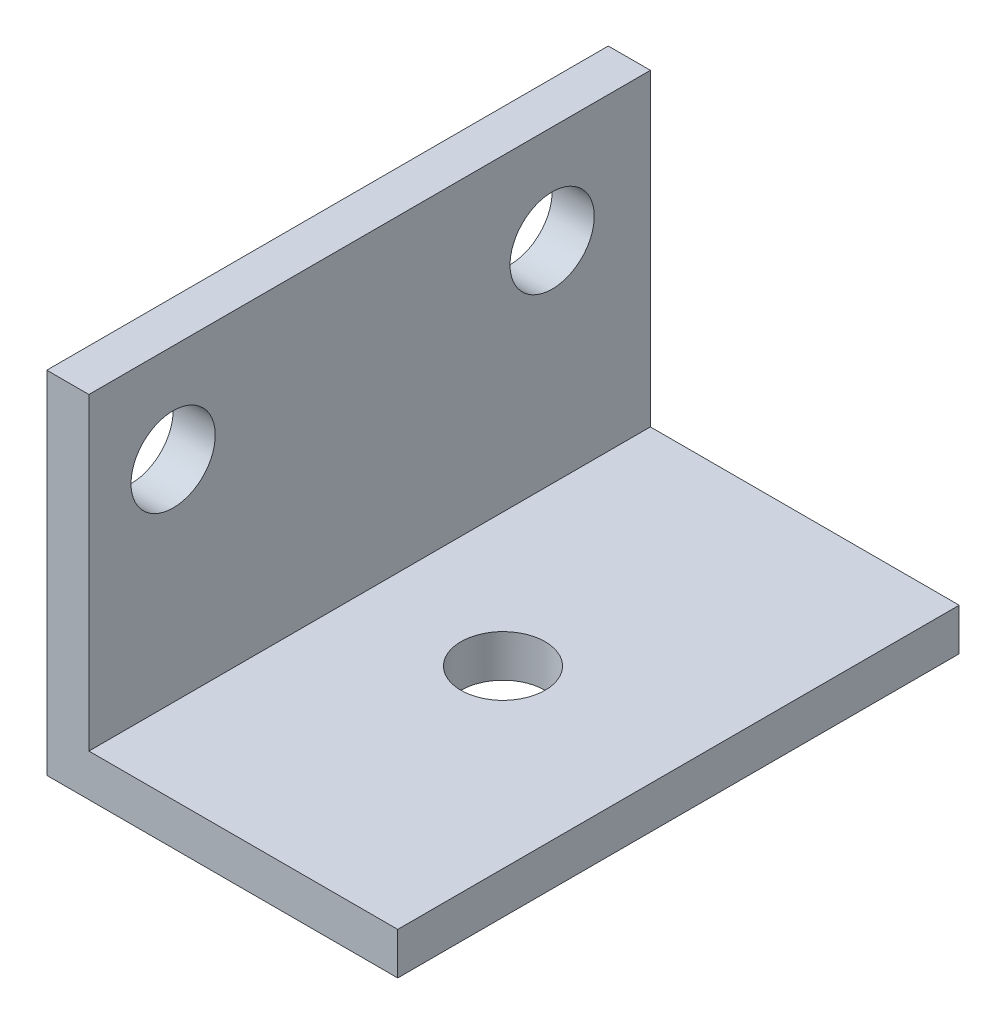
ISO-10303-21;
HEADER;
FILE_DESCRIPTION(('STEP AP214'),'2;1');
FILE_NAME('part.step','',(''),(''),'','','');
FILE_SCHEMA(('AUTOMOTIVE_DESIGN { 1 0 10303 214 1 1 1 1 }'));
ENDSEC;
DATA;
#1=APPLICATION_CONTEXT('core data for automotive mechanical design processes');
#2=APPLICATION_PROTOCOL_DEFINITION('international standard','automotive_design',2000,#1);
#3=PRODUCT_CONTEXT('',#1,'mechanical');
#4=PRODUCT('Part','Part','',(#3));
#5=PRODUCT_RELATED_PRODUCT_CATEGORY('part','',(#4));
#6=PRODUCT_DEFINITION_FORMATION('','',#4);
#7=PRODUCT_DEFINITION_CONTEXT('part definition',#1,'design');
#8=PRODUCT_DEFINITION('design','',#6,#7);
#9=PRODUCT_DEFINITION_SHAPE('','',#8);
#10=(LENGTH_UNIT() NAMED_UNIT(*) SI_UNIT(.MILLI.,.METRE.));
#11=(NAMED_UNIT(*) PLANE_ANGLE_UNIT() SI_UNIT($,.RADIAN.));
#12=(NAMED_UNIT(*) SI_UNIT($,.STERADIAN.) SOLID_ANGLE_UNIT());
#13=UNCERTAINTY_MEASURE_WITH_UNIT(LENGTH_MEASURE(1.E-05),#10,'distance_accuracy_value','');
#14=(GEOMETRIC_REPRESENTATION_CONTEXT(3) GLOBAL_UNCERTAINTY_ASSIGNED_CONTEXT((#13)) GLOBAL_UNIT_ASSIGNED_CONTEXT((#10,
#11,#12)) REPRESENTATION_CONTEXT('',''));
#15=CARTESIAN_POINT('',(0.,0.,0.));
#16=DIRECTION('',(0.,0.,1.));
#17=DIRECTION('',(1.,0.,0.));
#18=AXIS2_PLACEMENT_3D('',#15,#16,#17);
#19=CARTESIAN_POINT('',(0.,12.5,20.));
#20=DIRECTION('',(1.,0.,0.));
#21=DIRECTION('',(0.,1.,0.));
#22=AXIS2_PLACEMENT_3D('',#19,#20,#21);
#23=PLANE('',#22);
#24=CARTESIAN_POINT('',(0.,9.,17.));
#25=DIRECTION('',(-1.,0.,0.));
#26=DIRECTION('',(0.,-1.,0.));
#27=AXIS2_PLACEMENT_3D('',#24,#25,#26);
#28=CIRCLE('',#27,1.5);
#29=CARTESIAN_POINT('',(0.,7.5,17.));
#30=VERTEX_POINT('',#29);
#31=EDGE_CURVE('E183',#30,#30,#28,.T.);
#32=ORIENTED_EDGE('',*,*,#31,.F.);
#33=EDGE_LOOP('',(#32));
#34=FACE_BOUND('',#33,.T.);
#35=CARTESIAN_POINT('',(0.,9.,3.5));
#36=DIRECTION('',(-1.,0.,0.));
#37=DIRECTION('',(0.,-1.,0.));
#38=AXIS2_PLACEMENT_3D('',#35,#36,#37);
#39=CIRCLE('',#38,1.5);
#40=CARTESIAN_POINT('',(0.,7.5,3.5));
#41=VERTEX_POINT('',#40);
#42=EDGE_CURVE('E186',#41,#41,#39,.T.);
#43=ORIENTED_EDGE('',*,*,#42,.F.);
#44=EDGE_LOOP('',(#43));
#45=FACE_BOUND('',#44,.T.);
#46=DIRECTION('',(0.,-1.,0.));
#47=VECTOR('',#46,1.);
#48=CARTESIAN_POINT('',(0.,12.5,0.));
#49=LINE('',#48,#47);
#50=CARTESIAN_POINT('',(0.,12.5,0.));
#51=VERTEX_POINT('',#50);
#52=CARTESIAN_POINT('',(0.,0.,0.));
#53=VERTEX_POINT('',#52);
#54=EDGE_CURVE('E128',#51,#53,#49,.T.);
#55=ORIENTED_EDGE('',*,*,#54,.T.);
#56=DIRECTION('',(0.,0.,-1.));
#57=VECTOR('',#56,1.);
#58=CARTESIAN_POINT('',(0.,0.,20.));
#59=LINE('',#58,#57);
#60=CARTESIAN_POINT('',(0.,0.,20.));
#61=VERTEX_POINT('',#60);
#62=EDGE_CURVE('E11',#61,#53,#59,.T.);
#63=ORIENTED_EDGE('',*,*,#62,.F.);
#64=DIRECTION('',(0.,-1.,0.));
#65=VECTOR('',#64,1.);
#66=CARTESIAN_POINT('',(0.,12.5,20.));
#67=LINE('',#66,#65);
#68=CARTESIAN_POINT('',(0.,12.5,20.));
#69=VERTEX_POINT('',#68);
#70=EDGE_CURVE('E145',#69,#61,#67,.T.);
#71=ORIENTED_EDGE('',*,*,#70,.F.);
#72=DIRECTION('',(0.,0.,-1.));
#73=VECTOR('',#72,1.);
#74=CARTESIAN_POINT('',(0.,12.5,20.));
#75=LINE('',#74,#73);
#76=EDGE_CURVE('E124',#69,#51,#75,.T.);
#77=ORIENTED_EDGE('',*,*,#76,.T.);
#78=EDGE_LOOP('',(#55,#63,#71,#77));
#79=FACE_BOUND('',#78,.T.);
#80=ADVANCED_FACE('F39',(#34,#45,#79),#23,.F.);
#81=CARTESIAN_POINT('',(0.,0.,20.));
#82=DIRECTION('',(0.,1.,0.));
#83=DIRECTION('',(0.,0.,1.));
#84=AXIS2_PLACEMENT_3D('',#81,#82,#83);
#85=PLANE('',#84);
#86=CARTESIAN_POINT('',(6.25,0.,10.));
#87=DIRECTION('',(0.,-1.,0.));
#88=DIRECTION('',(0.,0.,-1.));
#89=AXIS2_PLACEMENT_3D('',#86,#87,#88);
#90=CIRCLE('',#89,1.5);
#91=CARTESIAN_POINT('',(6.25,0.,8.5));
#92=VERTEX_POINT('',#91);
#93=EDGE_CURVE('E197',#92,#92,#90,.T.);
#94=ORIENTED_EDGE('',*,*,#93,.F.);
#95=EDGE_LOOP('',(#94));
#96=FACE_BOUND('',#95,.T.);
#97=DIRECTION('',(1.,0.,0.));
#98=VECTOR('',#97,1.);
#99=CARTESIAN_POINT('',(0.,0.,0.));
#100=LINE('',#99,#98);
#101=CARTESIAN_POINT('',(12.5,0.,0.));
#102=VERTEX_POINT('',#101);
#103=EDGE_CURVE('E132',#53,#102,#100,.T.);
#104=ORIENTED_EDGE('',*,*,#103,.T.);
#105=DIRECTION('',(0.,0.,-1.));
#106=VECTOR('',#105,1.);
#107=CARTESIAN_POINT('',(12.5,0.,20.));
#108=LINE('',#107,#106);
#109=CARTESIAN_POINT('',(12.5,0.,20.));
#110=VERTEX_POINT('',#109);
#111=EDGE_CURVE('E48',#110,#102,#108,.T.);
#112=ORIENTED_EDGE('',*,*,#111,.F.);
#113=DIRECTION('',(1.,0.,0.));
#114=VECTOR('',#113,1.);
#115=CARTESIAN_POINT('',(0.,0.,20.));
#116=LINE('',#115,#114);
#117=EDGE_CURVE('E93',#61,#110,#116,.T.);
#118=ORIENTED_EDGE('',*,*,#117,.F.);
#119=ORIENTED_EDGE('',*,*,#62,.T.);
#120=EDGE_LOOP('',(#104,#112,#118,#119));
#121=FACE_BOUND('',#120,.T.);
#122=ADVANCED_FACE('F174',(#96,#121),#85,.F.);
#123=CARTESIAN_POINT('',(12.5,0.,20.));
#124=DIRECTION('',(-1.,0.,0.));
#125=DIRECTION('',(0.,0.,1.));
#126=AXIS2_PLACEMENT_3D('',#123,#124,#125);
#127=PLANE('',#126);
#128=DIRECTION('',(0.,1.,0.));
#129=VECTOR('',#128,1.);
#130=CARTESIAN_POINT('',(12.5,0.,0.));
#131=LINE('',#130,#129);
#132=CARTESIAN_POINT('',(12.5,1.5,0.));
#133=VERTEX_POINT('',#132);
#134=EDGE_CURVE('E136',#102,#133,#131,.T.);
#135=ORIENTED_EDGE('',*,*,#134,.T.);
#136=DIRECTION('',(0.,0.,-1.));
#137=VECTOR('',#136,1.);
#138=CARTESIAN_POINT('',(12.5,1.5,20.));
#139=LINE('',#138,#137);
#140=CARTESIAN_POINT('',(12.5,1.5,20.));
#141=VERTEX_POINT('',#140);
#142=EDGE_CURVE('E117',#141,#133,#139,.T.);
#143=ORIENTED_EDGE('',*,*,#142,.F.);
#144=DIRECTION('',(0.,1.,0.));
#145=VECTOR('',#144,1.);
#146=CARTESIAN_POINT('',(12.5,0.,20.));
#147=LINE('',#146,#145);
#148=EDGE_CURVE('E106',#110,#141,#147,.T.);
#149=ORIENTED_EDGE('',*,*,#148,.F.);
#150=ORIENTED_EDGE('',*,*,#111,.T.);
#151=EDGE_LOOP('',(#135,#143,#149,#150));
#152=FACE_BOUND('',#151,.T.);
#153=ADVANCED_FACE('F155',(#152),#127,.F.);
#154=CARTESIAN_POINT('',(12.5,1.5,20.));
#155=DIRECTION('',(0.,-1.,0.));
#156=DIRECTION('',(1.,0.,0.));
#157=AXIS2_PLACEMENT_3D('',#154,#155,#156);
#158=PLANE('',#157);
#159=CARTESIAN_POINT('',(6.25,1.5,10.));
#160=DIRECTION('',(0.,-1.,0.));
#161=DIRECTION('',(1.,0.,0.));
#162=AXIS2_PLACEMENT_3D('',#159,#160,#161);
#163=CIRCLE('',#162,1.5);
#164=CARTESIAN_POINT('',(7.75,1.5,10.));
#165=VERTEX_POINT('',#164);
#166=EDGE_CURVE('E190',#165,#165,#163,.F.);
#167=ORIENTED_EDGE('',*,*,#166,.F.);
#168=EDGE_LOOP('',(#167));
#169=FACE_BOUND('',#168,.T.);
#170=DIRECTION('',(-1.,0.,0.));
#171=VECTOR('',#170,1.);
#172=CARTESIAN_POINT('',(12.5,1.5,0.));
#173=LINE('',#172,#171);
#174=CARTESIAN_POINT('',(1.5,1.5,0.));
#175=VERTEX_POINT('',#174);
#176=EDGE_CURVE('E115',#133,#175,#173,.T.);
#177=ORIENTED_EDGE('',*,*,#176,.T.);
#178=DIRECTION('',(0.,0.,-1.));
#179=VECTOR('',#178,1.);
#180=CARTESIAN_POINT('',(1.5,1.5,20.));
#181=LINE('',#180,#179);
#182=CARTESIAN_POINT('',(1.5,1.5,20.));
#183=VERTEX_POINT('',#182);
#184=EDGE_CURVE('E112',#183,#175,#181,.T.);
#185=ORIENTED_EDGE('',*,*,#184,.F.);
#186=DIRECTION('',(-1.,0.,0.));
#187=VECTOR('',#186,1.);
#188=CARTESIAN_POINT('',(12.5,1.5,20.));
#189=LINE('',#188,#187);
#190=EDGE_CURVE('E100',#141,#183,#189,.T.);
#191=ORIENTED_EDGE('',*,*,#190,.F.);
#192=ORIENTED_EDGE('',*,*,#142,.T.);
#193=EDGE_LOOP('',(#177,#185,#191,#192));
#194=FACE_BOUND('',#193,.T.);
#195=ADVANCED_FACE('F113',(#169,#194),#158,.F.);
#196=CARTESIAN_POINT('',(1.5,1.5,20.));
#197=DIRECTION('',(-1.,0.,0.));
#198=DIRECTION('',(0.,-1.,0.));
#199=AXIS2_PLACEMENT_3D('',#196,#197,#198);
#200=PLANE('',#199);
#201=CARTESIAN_POINT('',(1.5,9.,17.));
#202=DIRECTION('',(-1.,0.,0.));
#203=DIRECTION('',(0.,-1.,0.));
#204=AXIS2_PLACEMENT_3D('',#201,#202,#203);
#205=CIRCLE('',#204,1.5);
#206=CARTESIAN_POINT('',(1.5,7.5,17.));
#207=VERTEX_POINT('',#206);
#208=EDGE_CURVE('E133',#207,#207,#205,.F.);
#209=ORIENTED_EDGE('',*,*,#208,.F.);
#210=EDGE_LOOP('',(#209));
#211=FACE_BOUND('',#210,.T.);
#212=CARTESIAN_POINT('',(1.5,9.,3.5));
#213=DIRECTION('',(-1.,0.,0.));
#214=DIRECTION('',(0.,-1.,0.));
#215=AXIS2_PLACEMENT_3D('',#212,#213,#214);
#216=CIRCLE('',#215,1.5);
#217=CARTESIAN_POINT('',(1.5,7.5,3.5));
#218=VERTEX_POINT('',#217);
#219=EDGE_CURVE('E189',#218,#218,#216,.F.);
#220=ORIENTED_EDGE('',*,*,#219,.F.);
#221=EDGE_LOOP('',(#220));
#222=FACE_BOUND('',#221,.T.);
#223=DIRECTION('',(0.,1.,0.));
#224=VECTOR('',#223,1.);
#225=CARTESIAN_POINT('',(1.5,1.5,0.));
#226=LINE('',#225,#224);
#227=CARTESIAN_POINT('',(1.5,12.5,0.));
#228=VERTEX_POINT('',#227);
#229=EDGE_CURVE('E79',#175,#228,#226,.T.);
#230=ORIENTED_EDGE('',*,*,#229,.T.);
#231=DIRECTION('',(0.,0.,-1.));
#232=VECTOR('',#231,1.);
#233=CARTESIAN_POINT('',(1.5,12.5,20.));
#234=LINE('',#233,#232);
#235=CARTESIAN_POINT('',(1.5,12.5,20.));
#236=VERTEX_POINT('',#235);
#237=EDGE_CURVE('E118',#236,#228,#234,.T.);
#238=ORIENTED_EDGE('',*,*,#237,.F.);
#239=DIRECTION('',(0.,1.,0.));
#240=VECTOR('',#239,1.);
#241=CARTESIAN_POINT('',(1.5,1.5,20.));
#242=LINE('',#241,#240);
#243=EDGE_CURVE('E104',#183,#236,#242,.T.);
#244=ORIENTED_EDGE('',*,*,#243,.F.);
#245=ORIENTED_EDGE('',*,*,#184,.T.);
#246=EDGE_LOOP('',(#230,#238,#244,#245));
#247=FACE_BOUND('',#246,.T.);
#248=ADVANCED_FACE('F120',(#211,#222,#247),#200,.F.);
#249=CARTESIAN_POINT('',(1.5,12.5,20.));
#250=DIRECTION('',(0.,-1.,0.));
#251=DIRECTION('',(0.,0.,-1.));
#252=AXIS2_PLACEMENT_3D('',#249,#250,#251);
#253=PLANE('',#252);
#254=DIRECTION('',(-1.,0.,0.));
#255=VECTOR('',#254,1.);
#256=CARTESIAN_POINT('',(1.5,12.5,0.));
#257=LINE('',#256,#255);
#258=EDGE_CURVE('E85',#228,#51,#257,.T.);
#259=ORIENTED_EDGE('',*,*,#258,.T.);
#260=ORIENTED_EDGE('',*,*,#76,.F.);
#261=DIRECTION('',(-1.,0.,0.));
#262=VECTOR('',#261,1.);
#263=CARTESIAN_POINT('',(1.5,12.5,20.));
#264=LINE('',#263,#262);
#265=EDGE_CURVE('E56',#236,#69,#264,.T.);
#266=ORIENTED_EDGE('',*,*,#265,.F.);
#267=ORIENTED_EDGE('',*,*,#237,.T.);
#268=EDGE_LOOP('',(#259,#260,#266,#267));
#269=FACE_BOUND('',#268,.T.);
#270=ADVANCED_FACE('F162',(#269),#253,.F.);
#271=CARTESIAN_POINT('',(0.,0.,20.));
#272=DIRECTION('',(0.,0.,1.));
#273=DIRECTION('',(1.,0.,0.));
#274=AXIS2_PLACEMENT_3D('',#271,#272,#273);
#275=PLANE('',#274);
#276=ORIENTED_EDGE('',*,*,#70,.T.);
#277=ORIENTED_EDGE('',*,*,#117,.T.);
#278=ORIENTED_EDGE('',*,*,#148,.T.);
#279=ORIENTED_EDGE('',*,*,#190,.T.);
#280=ORIENTED_EDGE('',*,*,#243,.T.);
#281=ORIENTED_EDGE('',*,*,#265,.T.);
#282=EDGE_LOOP('',(#276,#277,#278,#279,#280,#281));
#283=FACE_BOUND('',#282,.T.);
#284=ADVANCED_FACE('F102',(#283),#275,.T.);
#285=CARTESIAN_POINT('',(0.,0.,0.));
#286=DIRECTION('',(0.,0.,1.));
#287=DIRECTION('',(1.,0.,0.));
#288=AXIS2_PLACEMENT_3D('',#285,#286,#287);
#289=PLANE('',#288);
#290=ORIENTED_EDGE('',*,*,#54,.F.);
#291=ORIENTED_EDGE('',*,*,#258,.F.);
#292=ORIENTED_EDGE('',*,*,#229,.F.);
#293=ORIENTED_EDGE('',*,*,#176,.F.);
#294=ORIENTED_EDGE('',*,*,#134,.F.);
#295=ORIENTED_EDGE('',*,*,#103,.F.);
#296=EDGE_LOOP('',(#290,#291,#292,#293,#294,#295));
#297=FACE_BOUND('',#296,.T.);
#298=ADVANCED_FACE('F158',(#297),#289,.F.);
#299=CARTESIAN_POINT('',(5.74264068711929,9.,3.5));
#300=DIRECTION('',(-1.,0.,0.));
#301=DIRECTION('',(0.,-1.,0.));
#302=AXIS2_PLACEMENT_3D('',#299,#300,#301);
#303=CYLINDRICAL_SURFACE('',#302,1.5);
#304=ORIENTED_EDGE('',*,*,#219,.T.);
#305=EDGE_LOOP('',(#304));
#306=FACE_BOUND('',#305,.T.);
#307=ORIENTED_EDGE('',*,*,#42,.T.);
#308=EDGE_LOOP('',(#307));
#309=FACE_BOUND('',#308,.T.);
#310=ADVANCED_FACE('F223',(#306,#309),#303,.F.);
#311=CARTESIAN_POINT('',(5.74264068711929,9.,17.));
#312=DIRECTION('',(-1.,0.,0.));
#313=DIRECTION('',(0.,-1.,0.));
#314=AXIS2_PLACEMENT_3D('',#311,#312,#313);
#315=CYLINDRICAL_SURFACE('',#314,1.5);
#316=ORIENTED_EDGE('',*,*,#208,.T.);
#317=EDGE_LOOP('',(#316));
#318=FACE_BOUND('',#317,.T.);
#319=ORIENTED_EDGE('',*,*,#31,.T.);
#320=EDGE_LOOP('',(#319));
#321=FACE_BOUND('',#320,.T.);
#322=ADVANCED_FACE('F217',(#318,#321),#315,.F.);
#323=CARTESIAN_POINT('',(6.25,5.74264068711928,10.));
#324=DIRECTION('',(0.,-1.,0.));
#325=DIRECTION('',(0.,0.,-1.));
#326=AXIS2_PLACEMENT_3D('',#323,#324,#325);
#327=CYLINDRICAL_SURFACE('',#326,1.5);
#328=ORIENTED_EDGE('',*,*,#166,.T.);
#329=EDGE_LOOP('',(#328));
#330=FACE_BOUND('',#329,.T.);
#331=ORIENTED_EDGE('',*,*,#93,.T.);
#332=EDGE_LOOP('',(#331));
#333=FACE_BOUND('',#332,.T.);
#334=ADVANCED_FACE('F215',(#330,#333),#327,.F.);
#335=CLOSED_SHELL('',(#80,#122,#153,#195,#248,#270,#284,#298,#310,#322,#334));
#336=MANIFOLD_SOLID_BREP('B2',#335);
#337=ADVANCED_BREP_SHAPE_REPRESENTATION('',(#18,#336),#14);
#338=SHAPE_DEFINITION_REPRESENTATION(#9,#337);
ENDSEC;
END-ISO-10303-21;
